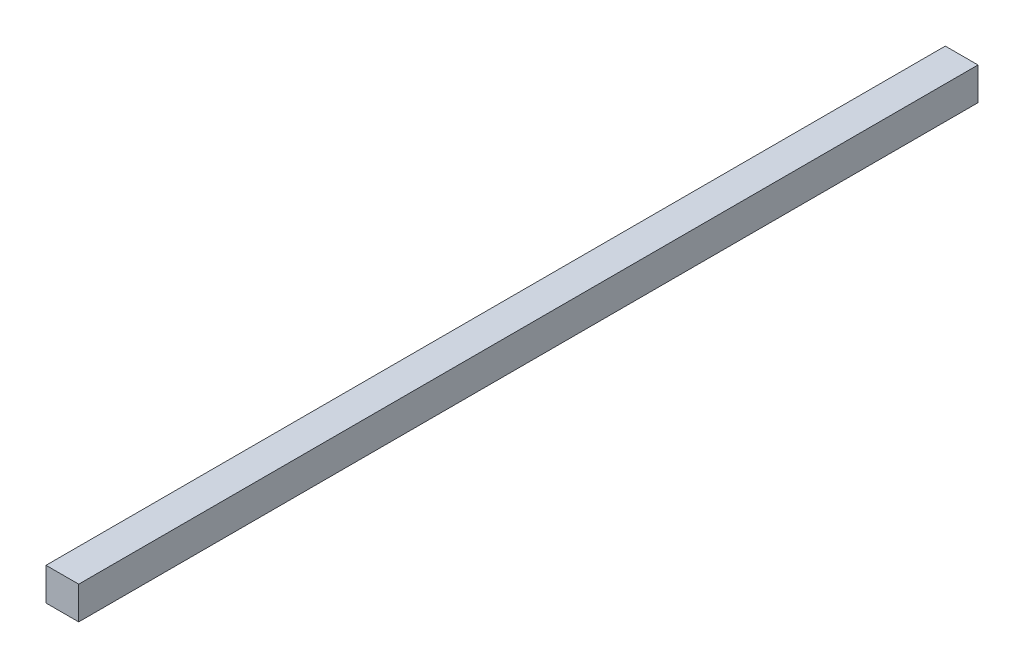
ISO-10303-21;
HEADER;
FILE_DESCRIPTION(('STEP AP214'),'2;1');
FILE_NAME('part.step','',(''),(''),'','','');
FILE_SCHEMA(('AUTOMOTIVE_DESIGN { 1 0 10303 214 1 1 1 1 }'));
ENDSEC;
DATA;
#1=APPLICATION_CONTEXT('core data for automotive mechanical design processes');
#2=APPLICATION_PROTOCOL_DEFINITION('international standard','automotive_design',2000,#1);
#3=PRODUCT_CONTEXT('',#1,'mechanical');
#4=PRODUCT('Part','Part','',(#3));
#5=PRODUCT_RELATED_PRODUCT_CATEGORY('part','',(#4));
#6=PRODUCT_DEFINITION_FORMATION('','',#4);
#7=PRODUCT_DEFINITION_CONTEXT('part definition',#1,'design');
#8=PRODUCT_DEFINITION('design','',#6,#7);
#9=PRODUCT_DEFINITION_SHAPE('','',#8);
#10=(LENGTH_UNIT() NAMED_UNIT(*) SI_UNIT(.MILLI.,.METRE.));
#11=(NAMED_UNIT(*) PLANE_ANGLE_UNIT() SI_UNIT($,.RADIAN.));
#12=(NAMED_UNIT(*) SI_UNIT($,.STERADIAN.) SOLID_ANGLE_UNIT());
#13=UNCERTAINTY_MEASURE_WITH_UNIT(LENGTH_MEASURE(1.E-05),#10,'distance_accuracy_value','');
#14=(GEOMETRIC_REPRESENTATION_CONTEXT(3) GLOBAL_UNCERTAINTY_ASSIGNED_CONTEXT((#13)) GLOBAL_UNIT_ASSIGNED_CONTEXT((#10,
#11,#12)) REPRESENTATION_CONTEXT('',''));
#15=CARTESIAN_POINT('',(0.,0.,0.));
#16=DIRECTION('',(0.,0.,1.));
#17=DIRECTION('',(1.,0.,0.));
#18=AXIS2_PLACEMENT_3D('',#15,#16,#17);
#19=CARTESIAN_POINT('',(10.,-10.,550.));
#20=DIRECTION('',(-1.,0.,0.));
#21=DIRECTION('',(0.,0.,1.));
#22=AXIS2_PLACEMENT_3D('',#19,#20,#21);
#23=PLANE('',#22);
#24=DIRECTION('',(0.,1.,0.));
#25=VECTOR('',#24,1.);
#26=CARTESIAN_POINT('',(10.,-10.,0.));
#27=LINE('',#26,#25);
#28=CARTESIAN_POINT('',(10.,-10.,0.));
#29=VERTEX_POINT('',#28);
#30=CARTESIAN_POINT('',(10.,10.,0.));
#31=VERTEX_POINT('',#30);
#32=EDGE_CURVE('E96',#29,#31,#27,.T.);
#33=ORIENTED_EDGE('',*,*,#32,.T.);
#34=DIRECTION('',(0.,0.,-1.));
#35=VECTOR('',#34,1.);
#36=CARTESIAN_POINT('',(10.,10.,550.));
#37=LINE('',#36,#35);
#38=CARTESIAN_POINT('',(10.,10.,550.));
#39=VERTEX_POINT('',#38);
#40=EDGE_CURVE('E11',#39,#31,#37,.T.);
#41=ORIENTED_EDGE('',*,*,#40,.F.);
#42=DIRECTION('',(0.,1.,0.));
#43=VECTOR('',#42,1.);
#44=CARTESIAN_POINT('',(10.,-10.,550.));
#45=LINE('',#44,#43);
#46=CARTESIAN_POINT('',(10.,-10.,550.));
#47=VERTEX_POINT('',#46);
#48=EDGE_CURVE('E84',#47,#39,#45,.T.);
#49=ORIENTED_EDGE('',*,*,#48,.F.);
#50=DIRECTION('',(0.,0.,-1.));
#51=VECTOR('',#50,1.);
#52=CARTESIAN_POINT('',(10.,-10.,550.));
#53=LINE('',#52,#51);
#54=EDGE_CURVE('E92',#47,#29,#53,.T.);
#55=ORIENTED_EDGE('',*,*,#54,.T.);
#56=EDGE_LOOP('',(#33,#41,#49,#55));
#57=FACE_BOUND('',#56,.T.);
#58=ADVANCED_FACE('F33',(#57),#23,.F.);
#59=CARTESIAN_POINT('',(-10.,10.,550.));
#60=DIRECTION('',(0.,-1.,0.));
#61=DIRECTION('',(0.,0.,-1.));
#62=AXIS2_PLACEMENT_3D('',#59,#60,#61);
#63=PLANE('',#62);
#64=DIRECTION('',(-1.,0.,0.));
#65=VECTOR('',#64,1.);
#66=CARTESIAN_POINT('',(-10.,10.,0.));
#67=LINE('',#66,#65);
#68=CARTESIAN_POINT('',(-10.,10.,0.));
#69=VERTEX_POINT('',#68);
#70=EDGE_CURVE('E88',#31,#69,#67,.T.);
#71=ORIENTED_EDGE('',*,*,#70,.T.);
#72=DIRECTION('',(0.,0.,-1.));
#73=VECTOR('',#72,1.);
#74=CARTESIAN_POINT('',(-10.,10.,550.));
#75=LINE('',#74,#73);
#76=CARTESIAN_POINT('',(-10.,10.,550.));
#77=VERTEX_POINT('',#76);
#78=EDGE_CURVE('E41',#77,#69,#75,.T.);
#79=ORIENTED_EDGE('',*,*,#78,.F.);
#80=DIRECTION('',(-1.,0.,0.));
#81=VECTOR('',#80,1.);
#82=CARTESIAN_POINT('',(-10.,10.,550.));
#83=LINE('',#82,#81);
#84=EDGE_CURVE('E79',#39,#77,#83,.T.);
#85=ORIENTED_EDGE('',*,*,#84,.F.);
#86=ORIENTED_EDGE('',*,*,#40,.T.);
#87=EDGE_LOOP('',(#71,#79,#85,#86));
#88=FACE_BOUND('',#87,.T.);
#89=ADVANCED_FACE('F87',(#88),#63,.F.);
#90=CARTESIAN_POINT('',(-10.,-10.,550.));
#91=DIRECTION('',(1.,0.,0.));
#92=DIRECTION('',(0.,0.,-1.));
#93=AXIS2_PLACEMENT_3D('',#90,#91,#92);
#94=PLANE('',#93);
#95=DIRECTION('',(0.,-1.,0.));
#96=VECTOR('',#95,1.);
#97=CARTESIAN_POINT('',(-10.,-10.,0.));
#98=LINE('',#97,#96);
#99=CARTESIAN_POINT('',(-10.,-10.,0.));
#100=VERTEX_POINT('',#99);
#101=EDGE_CURVE('E66',#69,#100,#98,.T.);
#102=ORIENTED_EDGE('',*,*,#101,.T.);
#103=DIRECTION('',(0.,0.,-1.));
#104=VECTOR('',#103,1.);
#105=CARTESIAN_POINT('',(-10.,-10.,550.));
#106=LINE('',#105,#104);
#107=CARTESIAN_POINT('',(-10.,-10.,550.));
#108=VERTEX_POINT('',#107);
#109=EDGE_CURVE('E89',#108,#100,#106,.T.);
#110=ORIENTED_EDGE('',*,*,#109,.F.);
#111=DIRECTION('',(0.,-1.,0.));
#112=VECTOR('',#111,1.);
#113=CARTESIAN_POINT('',(-10.,-10.,550.));
#114=LINE('',#113,#112);
#115=EDGE_CURVE('E82',#77,#108,#114,.T.);
#116=ORIENTED_EDGE('',*,*,#115,.F.);
#117=ORIENTED_EDGE('',*,*,#78,.T.);
#118=EDGE_LOOP('',(#102,#110,#116,#117));
#119=FACE_BOUND('',#118,.T.);
#120=ADVANCED_FACE('F90',(#119),#94,.F.);
#121=CARTESIAN_POINT('',(-10.,-10.,550.));
#122=DIRECTION('',(0.,1.,0.));
#123=DIRECTION('',(0.,0.,1.));
#124=AXIS2_PLACEMENT_3D('',#121,#122,#123);
#125=PLANE('',#124);
#126=DIRECTION('',(1.,0.,0.));
#127=VECTOR('',#126,1.);
#128=CARTESIAN_POINT('',(-10.,-10.,0.));
#129=LINE('',#128,#127);
#130=EDGE_CURVE('E72',#100,#29,#129,.T.);
#131=ORIENTED_EDGE('',*,*,#130,.T.);
#132=ORIENTED_EDGE('',*,*,#54,.F.);
#133=DIRECTION('',(1.,0.,0.));
#134=VECTOR('',#133,1.);
#135=CARTESIAN_POINT('',(-10.,-10.,550.));
#136=LINE('',#135,#134);
#137=EDGE_CURVE('E49',#108,#47,#136,.T.);
#138=ORIENTED_EDGE('',*,*,#137,.F.);
#139=ORIENTED_EDGE('',*,*,#109,.T.);
#140=EDGE_LOOP('',(#131,#132,#138,#139));
#141=FACE_BOUND('',#140,.T.);
#142=ADVANCED_FACE('F103',(#141),#125,.F.);
#143=CARTESIAN_POINT('',(0.,0.,550.));
#144=DIRECTION('',(0.,0.,-1.));
#145=DIRECTION('',(-1.,0.,0.));
#146=AXIS2_PLACEMENT_3D('',#143,#144,#145);
#147=PLANE('',#146);
#148=ORIENTED_EDGE('',*,*,#48,.T.);
#149=ORIENTED_EDGE('',*,*,#84,.T.);
#150=ORIENTED_EDGE('',*,*,#115,.T.);
#151=ORIENTED_EDGE('',*,*,#137,.T.);
#152=EDGE_LOOP('',(#148,#149,#150,#151));
#153=FACE_BOUND('',#152,.T.);
#154=ADVANCED_FACE('F80',(#153),#147,.F.);
#155=CARTESIAN_POINT('',(0.,0.,0.));
#156=DIRECTION('',(0.,0.,-1.));
#157=DIRECTION('',(-1.,0.,0.));
#158=AXIS2_PLACEMENT_3D('',#155,#156,#157);
#159=PLANE('',#158);
#160=ORIENTED_EDGE('',*,*,#32,.F.);
#161=ORIENTED_EDGE('',*,*,#130,.F.);
#162=ORIENTED_EDGE('',*,*,#101,.F.);
#163=ORIENTED_EDGE('',*,*,#70,.F.);
#164=EDGE_LOOP('',(#160,#161,#162,#163));
#165=FACE_BOUND('',#164,.T.);
#166=ADVANCED_FACE('F106',(#165),#159,.T.);
#167=CLOSED_SHELL('',(#58,#89,#120,#142,#154,#166));
#168=MANIFOLD_SOLID_BREP('B2',#167);
#169=ADVANCED_BREP_SHAPE_REPRESENTATION('',(#18,#168),#14);
#170=SHAPE_DEFINITION_REPRESENTATION(#9,#169);
ENDSEC;
END-ISO-10303-21;
